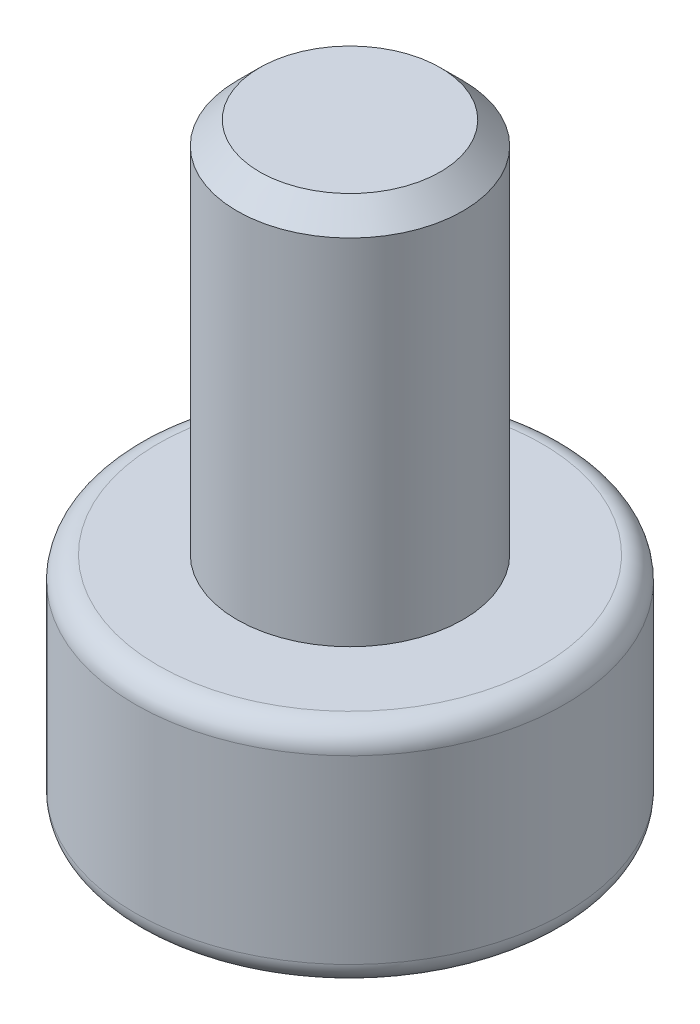
ISO-10303-21;
HEADER;
FILE_DESCRIPTION(('STEP AP214'),'2;1');
FILE_NAME('part.step','',(''),(''),'','','');
FILE_SCHEMA(('AUTOMOTIVE_DESIGN { 1 0 10303 214 1 1 1 1 }'));
ENDSEC;
DATA;
#1=APPLICATION_CONTEXT('core data for automotive mechanical design processes');
#2=APPLICATION_PROTOCOL_DEFINITION('international standard','automotive_design',2000,#1);
#3=PRODUCT_CONTEXT('',#1,'mechanical');
#4=PRODUCT('Part','Part','',(#3));
#5=PRODUCT_RELATED_PRODUCT_CATEGORY('part','',(#4));
#6=PRODUCT_DEFINITION_FORMATION('','',#4);
#7=PRODUCT_DEFINITION_CONTEXT('part definition',#1,'design');
#8=PRODUCT_DEFINITION('design','',#6,#7);
#9=PRODUCT_DEFINITION_SHAPE('','',#8);
#10=(LENGTH_UNIT() NAMED_UNIT(*) SI_UNIT(.MILLI.,.METRE.));
#11=(NAMED_UNIT(*) PLANE_ANGLE_UNIT() SI_UNIT($,.RADIAN.));
#12=(NAMED_UNIT(*) SI_UNIT($,.STERADIAN.) SOLID_ANGLE_UNIT());
#13=UNCERTAINTY_MEASURE_WITH_UNIT(LENGTH_MEASURE(1.E-05),#10,'distance_accuracy_value','');
#14=(GEOMETRIC_REPRESENTATION_CONTEXT(3) GLOBAL_UNCERTAINTY_ASSIGNED_CONTEXT((#13)) GLOBAL_UNIT_ASSIGNED_CONTEXT((#10,
#11,#12)) REPRESENTATION_CONTEXT('',''));
#15=CARTESIAN_POINT('',(0.,0.,0.));
#16=DIRECTION('',(0.,0.,1.));
#17=DIRECTION('',(1.,0.,0.));
#18=AXIS2_PLACEMENT_3D('',#15,#16,#17);
#19=CARTESIAN_POINT('',(0.,3.,0.));
#20=DIRECTION('',(0.,-1.,0.));
#21=DIRECTION('',(0.,0.,-1.));
#22=AXIS2_PLACEMENT_3D('',#19,#20,#21);
#23=CYLINDRICAL_SURFACE('',#22,2.85);
#24=CARTESIAN_POINT('',(0.,2.7,0.));
#25=DIRECTION('',(0.,1.,0.));
#26=DIRECTION('',(0.,0.,1.));
#27=AXIS2_PLACEMENT_3D('',#24,#25,#26);
#28=CIRCLE('',#27,2.85);
#29=CARTESIAN_POINT('',(0.,2.7,2.85));
#30=VERTEX_POINT('',#29);
#31=EDGE_CURVE('E68',#30,#30,#28,.F.);
#32=ORIENTED_EDGE('',*,*,#31,.T.);
#33=EDGE_LOOP('',(#32));
#34=FACE_BOUND('',#33,.T.);
#35=CARTESIAN_POINT('',(0.,0.3,0.));
#36=DIRECTION('',(0.,1.,0.));
#37=DIRECTION('',(0.,0.,1.));
#38=AXIS2_PLACEMENT_3D('',#35,#36,#37);
#39=CIRCLE('',#38,2.85);
#40=CARTESIAN_POINT('',(0.,0.3,2.85));
#41=VERTEX_POINT('',#40);
#42=EDGE_CURVE('E72',#41,#41,#39,.T.);
#43=ORIENTED_EDGE('',*,*,#42,.T.);
#44=EDGE_LOOP('',(#43));
#45=FACE_BOUND('',#44,.T.);
#46=ADVANCED_FACE('F39',(#34,#45),#23,.T.);
#47=CARTESIAN_POINT('',(0.,3.,0.));
#48=DIRECTION('',(0.,1.,0.));
#49=DIRECTION('',(0.,0.,1.));
#50=AXIS2_PLACEMENT_3D('',#47,#48,#49);
#51=PLANE('',#50);
#52=CARTESIAN_POINT('',(0.,3.,0.));
#53=DIRECTION('',(0.,1.,0.));
#54=DIRECTION('',(0.,0.,1.));
#55=AXIS2_PLACEMENT_3D('',#52,#53,#54);
#56=CIRCLE('',#55,2.55);
#57=CARTESIAN_POINT('',(0.,3.,2.55));
#58=VERTEX_POINT('',#57);
#59=EDGE_CURVE('E76',#58,#58,#56,.T.);
#60=ORIENTED_EDGE('',*,*,#59,.T.);
#61=EDGE_LOOP('',(#60));
#62=FACE_BOUND('',#61,.T.);
#63=CARTESIAN_POINT('',(0.,3.,0.));
#64=DIRECTION('',(0.,1.,0.));
#65=DIRECTION('',(0.,0.,1.));
#66=AXIS2_PLACEMENT_3D('',#63,#64,#65);
#67=CIRCLE('',#66,1.5);
#68=CARTESIAN_POINT('',(0.,3.,1.5));
#69=VERTEX_POINT('',#68);
#70=EDGE_CURVE('E80',#69,#69,#67,.T.);
#71=ORIENTED_EDGE('',*,*,#70,.F.);
#72=EDGE_LOOP('',(#71));
#73=FACE_BOUND('',#72,.T.);
#74=ADVANCED_FACE('F105',(#62,#73),#51,.T.);
#75=CARTESIAN_POINT('',(0.,0.,0.));
#76=DIRECTION('',(0.,1.,0.));
#77=DIRECTION('',(0.,0.,1.));
#78=AXIS2_PLACEMENT_3D('',#75,#76,#77);
#79=PLANE('',#78);
#80=CARTESIAN_POINT('',(0.,0.,0.));
#81=DIRECTION('',(0.,1.,0.));
#82=DIRECTION('',(0.,0.,1.));
#83=AXIS2_PLACEMENT_3D('',#80,#81,#82);
#84=CIRCLE('',#83,1.44);
#85=CARTESIAN_POINT('',(0.,0.,1.44));
#86=VERTEX_POINT('',#85);
#87=EDGE_CURVE('E10',#86,#86,#84,.T.);
#88=ORIENTED_EDGE('',*,*,#87,.T.);
#89=EDGE_LOOP('',(#88));
#90=FACE_BOUND('',#89,.T.);
#91=CARTESIAN_POINT('',(0.,0.,0.));
#92=DIRECTION('',(0.,1.,0.));
#93=DIRECTION('',(0.,0.,1.));
#94=AXIS2_PLACEMENT_3D('',#91,#92,#93);
#95=CIRCLE('',#94,2.55);
#96=CARTESIAN_POINT('',(0.,0.,2.55));
#97=VERTEX_POINT('',#96);
#98=EDGE_CURVE('E64',#97,#97,#95,.F.);
#99=ORIENTED_EDGE('',*,*,#98,.T.);
#100=EDGE_LOOP('',(#99));
#101=FACE_BOUND('',#100,.T.);
#102=ADVANCED_FACE('F111',(#90,#101),#79,.F.);
#103=CARTESIAN_POINT('',(0.,8.,0.));
#104=DIRECTION('',(0.,-1.,0.));
#105=DIRECTION('',(0.,0.,-1.));
#106=AXIS2_PLACEMENT_3D('',#103,#104,#105);
#107=CYLINDRICAL_SURFACE('',#106,1.5);
#108=CARTESIAN_POINT('',(0.,7.7,0.));
#109=DIRECTION('',(0.,1.,0.));
#110=DIRECTION('',(0.,0.,1.));
#111=AXIS2_PLACEMENT_3D('',#108,#109,#110);
#112=CIRCLE('',#111,1.5);
#113=CARTESIAN_POINT('',(0.,7.7,1.5));
#114=VERTEX_POINT('',#113);
#115=EDGE_CURVE('E53',#114,#114,#112,.F.);
#116=ORIENTED_EDGE('',*,*,#115,.T.);
#117=EDGE_LOOP('',(#116));
#118=FACE_BOUND('',#117,.T.);
#119=ORIENTED_EDGE('',*,*,#70,.T.);
#120=EDGE_LOOP('',(#119));
#121=FACE_BOUND('',#120,.T.);
#122=ADVANCED_FACE('F101',(#118,#121),#107,.T.);
#123=CARTESIAN_POINT('',(0.,8.,0.));
#124=DIRECTION('',(0.,1.,0.));
#125=DIRECTION('',(0.,0.,1.));
#126=AXIS2_PLACEMENT_3D('',#123,#124,#125);
#127=PLANE('',#126);
#128=CARTESIAN_POINT('',(0.,8.,0.));
#129=DIRECTION('',(0.,1.,0.));
#130=DIRECTION('',(0.,0.,1.));
#131=AXIS2_PLACEMENT_3D('',#128,#129,#130);
#132=CIRCLE('',#131,1.2);
#133=CARTESIAN_POINT('',(0.,8.,1.2));
#134=VERTEX_POINT('',#133);
#135=EDGE_CURVE('E58',#134,#134,#132,.T.);
#136=ORIENTED_EDGE('',*,*,#135,.T.);
#137=EDGE_LOOP('',(#136));
#138=FACE_BOUND('',#137,.T.);
#139=ADVANCED_FACE('F93',(#138),#127,.T.);
#140=CARTESIAN_POINT('',(0.,1.3,0.));
#141=DIRECTION('',(0.,-1.,0.));
#142=DIRECTION('',(0.,0.,-1.));
#143=AXIS2_PLACEMENT_3D('',#140,#141,#142);
#144=CYLINDRICAL_SURFACE('',#143,1.29);
#145=CARTESIAN_POINT('',(0.,0.150000000000001,0.));
#146=DIRECTION('',(0.,1.,0.));
#147=DIRECTION('',(0.,0.,1.));
#148=AXIS2_PLACEMENT_3D('',#145,#146,#147);
#149=CIRCLE('',#148,1.29);
#150=CARTESIAN_POINT('',(0.,0.150000000000001,1.29));
#151=VERTEX_POINT('',#150);
#152=EDGE_CURVE('E48',#151,#151,#149,.F.);
#153=ORIENTED_EDGE('',*,*,#152,.T.);
#154=EDGE_LOOP('',(#153));
#155=FACE_BOUND('',#154,.T.);
#156=CARTESIAN_POINT('',(0.,1.3,0.));
#157=DIRECTION('',(0.,-1.,0.));
#158=DIRECTION('',(0.,0.,-1.));
#159=AXIS2_PLACEMENT_3D('',#156,#157,#158);
#160=CIRCLE('',#159,1.29);
#161=CARTESIAN_POINT('',(0.,1.3,-1.29));
#162=VERTEX_POINT('',#161);
#163=EDGE_CURVE('E84',#162,#162,#160,.T.);
#164=ORIENTED_EDGE('',*,*,#163,.F.);
#165=EDGE_LOOP('',(#164));
#166=FACE_BOUND('',#165,.T.);
#167=ADVANCED_FACE('F91',(#155,#166),#144,.F.);
#168=CARTESIAN_POINT('',(0.,1.3,0.));
#169=DIRECTION('',(0.,-1.,0.));
#170=DIRECTION('',(0.,0.,-1.));
#171=AXIS2_PLACEMENT_3D('',#168,#169,#170);
#172=PLANE('',#171);
#173=ORIENTED_EDGE('',*,*,#163,.T.);
#174=EDGE_LOOP('',(#173));
#175=FACE_BOUND('',#174,.T.);
#176=ADVANCED_FACE('F89',(#175),#172,.T.);
#177=CARTESIAN_POINT('',(0.,2.7,0.));
#178=DIRECTION('',(0.,1.,0.));
#179=DIRECTION('',(0.,0.,1.));
#180=AXIS2_PLACEMENT_3D('',#177,#178,#179);
#181=TOROIDAL_SURFACE('',#180,2.55,0.3);
#182=ORIENTED_EDGE('',*,*,#31,.F.);
#183=EDGE_LOOP('',(#182));
#184=FACE_BOUND('',#183,.T.);
#185=ORIENTED_EDGE('',*,*,#59,.F.);
#186=EDGE_LOOP('',(#185));
#187=FACE_BOUND('',#186,.T.);
#188=ADVANCED_FACE('F99',(#184,#187),#181,.T.);
#189=CARTESIAN_POINT('',(0.,0.3,0.));
#190=DIRECTION('',(0.,1.,0.));
#191=DIRECTION('',(0.,0.,1.));
#192=AXIS2_PLACEMENT_3D('',#189,#190,#191);
#193=TOROIDAL_SURFACE('',#192,2.55,0.3);
#194=ORIENTED_EDGE('',*,*,#98,.F.);
#195=EDGE_LOOP('',(#194));
#196=FACE_BOUND('',#195,.T.);
#197=ORIENTED_EDGE('',*,*,#42,.F.);
#198=EDGE_LOOP('',(#197));
#199=FACE_BOUND('',#198,.T.);
#200=ADVANCED_FACE('F119',(#196,#199),#193,.T.);
#201=CARTESIAN_POINT('',(0.,8.,0.));
#202=DIRECTION('',(0.,-1.,0.));
#203=DIRECTION('',(0.,0.,-1.));
#204=AXIS2_PLACEMENT_3D('',#201,#202,#203);
#205=CONICAL_SURFACE('',#204,1.2,0.785398163397447);
#206=ORIENTED_EDGE('',*,*,#115,.F.);
#207=EDGE_LOOP('',(#206));
#208=FACE_BOUND('',#207,.T.);
#209=ORIENTED_EDGE('',*,*,#135,.F.);
#210=EDGE_LOOP('',(#209));
#211=FACE_BOUND('',#210,.T.);
#212=ADVANCED_FACE('F122',(#208,#211),#205,.T.);
#213=CARTESIAN_POINT('',(0.,0.150000000000001,0.));
#214=DIRECTION('',(0.,-1.,0.));
#215=DIRECTION('',(0.,0.,-1.));
#216=AXIS2_PLACEMENT_3D('',#213,#214,#215);
#217=CONICAL_SURFACE('',#216,1.29,0.78539816339745);
#218=ORIENTED_EDGE('',*,*,#87,.F.);
#219=EDGE_LOOP('',(#218));
#220=FACE_BOUND('',#219,.T.);
#221=ORIENTED_EDGE('',*,*,#152,.F.);
#222=EDGE_LOOP('',(#221));
#223=FACE_BOUND('',#222,.T.);
#224=ADVANCED_FACE('F42',(#220,#223),#217,.F.);
#225=CLOSED_SHELL('',(#46,#74,#102,#122,#139,#167,#176,#188,#200,#212,#224));
#226=MANIFOLD_SOLID_BREP('B2',#225);
#227=ADVANCED_BREP_SHAPE_REPRESENTATION('',(#18,#226),#14);
#228=SHAPE_DEFINITION_REPRESENTATION(#9,#227);
ENDSEC;
END-ISO-10303-21;
